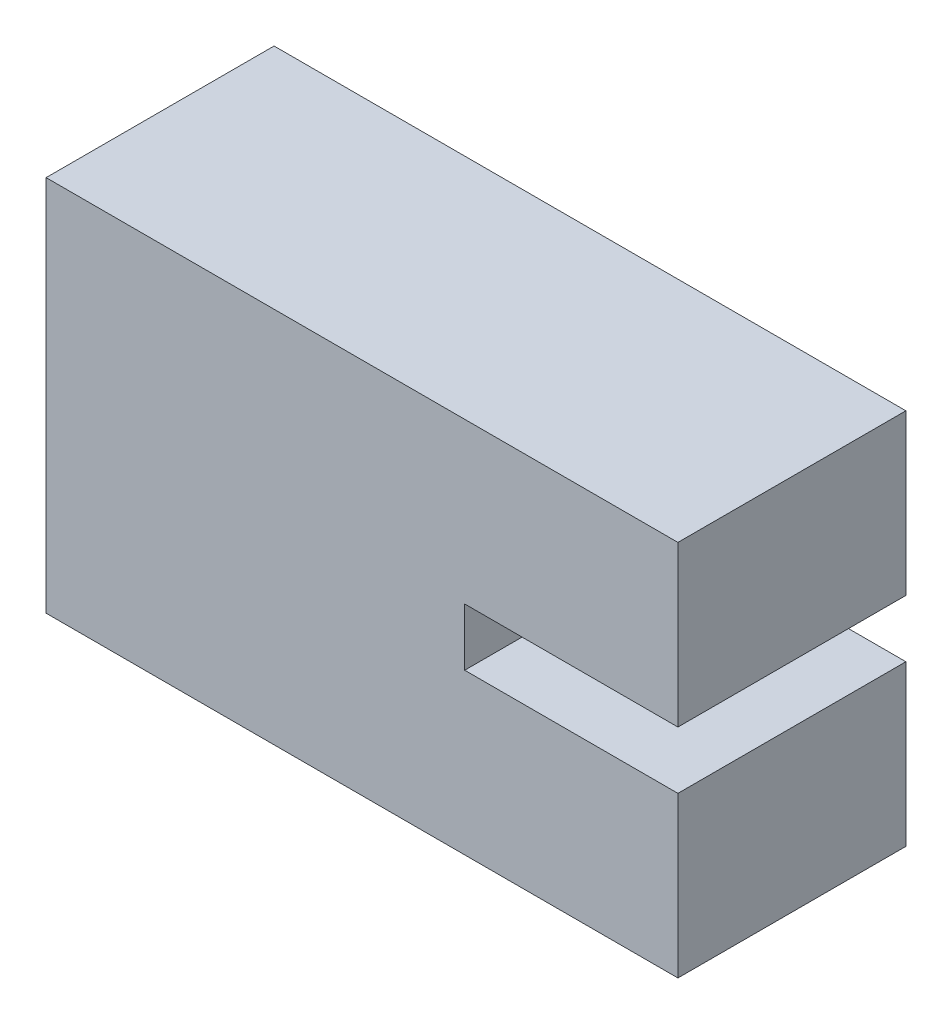
ISO-10303-21;
HEADER;
FILE_DESCRIPTION(('STEP AP214'),'2;1');
FILE_NAME('part.step','',(''),(''),'','','');
FILE_SCHEMA(('AUTOMOTIVE_DESIGN { 1 0 10303 214 1 1 1 1 }'));
ENDSEC;
DATA;
#1=APPLICATION_CONTEXT('core data for automotive mechanical design processes');
#2=APPLICATION_PROTOCOL_DEFINITION('international standard','automotive_design',2000,#1);
#3=PRODUCT_CONTEXT('',#1,'mechanical');
#4=PRODUCT('Part','Part','',(#3));
#5=PRODUCT_RELATED_PRODUCT_CATEGORY('part','',(#4));
#6=PRODUCT_DEFINITION_FORMATION('','',#4);
#7=PRODUCT_DEFINITION_CONTEXT('part definition',#1,'design');
#8=PRODUCT_DEFINITION('design','',#6,#7);
#9=PRODUCT_DEFINITION_SHAPE('','',#8);
#10=(LENGTH_UNIT() NAMED_UNIT(*) SI_UNIT(.MILLI.,.METRE.));
#11=(NAMED_UNIT(*) PLANE_ANGLE_UNIT() SI_UNIT($,.RADIAN.));
#12=(NAMED_UNIT(*) SI_UNIT($,.STERADIAN.) SOLID_ANGLE_UNIT());
#13=UNCERTAINTY_MEASURE_WITH_UNIT(LENGTH_MEASURE(1.E-05),#10,'distance_accuracy_value','');
#14=(GEOMETRIC_REPRESENTATION_CONTEXT(3) GLOBAL_UNCERTAINTY_ASSIGNED_CONTEXT((#13)) GLOBAL_UNIT_ASSIGNED_CONTEXT((#10,
#11,#12)) REPRESENTATION_CONTEXT('',''));
#15=CARTESIAN_POINT('',(0.,0.,0.));
#16=DIRECTION('',(0.,0.,1.));
#17=DIRECTION('',(1.,0.,0.));
#18=AXIS2_PLACEMENT_3D('',#15,#16,#17);
#19=CARTESIAN_POINT('',(19.7045905833706,0.,8.552959));
#20=DIRECTION('',(0.,1.,0.));
#21=DIRECTION('',(0.,0.,1.));
#22=AXIS2_PLACEMENT_3D('',#19,#20,#21);
#23=PLANE('',#22);
#24=DIRECTION('',(1.,0.,0.));
#25=VECTOR('',#24,1.);
#26=CARTESIAN_POINT('',(19.7045905833706,0.,0.));
#27=LINE('',#26,#25);
#28=CARTESIAN_POINT('',(-4.,0.,0.));
#29=VERTEX_POINT('',#28);
#30=CARTESIAN_POINT('',(19.7045905833706,0.,0.));
#31=VERTEX_POINT('',#30);
#32=EDGE_CURVE('E123',#29,#31,#27,.T.);
#33=ORIENTED_EDGE('',*,*,#32,.T.);
#34=DIRECTION('',(0.,0.,-1.));
#35=VECTOR('',#34,1.);
#36=CARTESIAN_POINT('',(19.7045905833706,0.,8.552959));
#37=LINE('',#36,#35);
#38=CARTESIAN_POINT('',(19.7045905833706,0.,8.552959));
#39=VERTEX_POINT('',#38);
#40=EDGE_CURVE('E11',#39,#31,#37,.T.);
#41=ORIENTED_EDGE('',*,*,#40,.F.);
#42=DIRECTION('',(1.,0.,0.));
#43=VECTOR('',#42,1.);
#44=CARTESIAN_POINT('',(19.7045905833706,0.,8.552959));
#45=LINE('',#44,#43);
#46=CARTESIAN_POINT('',(-4.,0.,8.552959));
#47=VERTEX_POINT('',#46);
#48=EDGE_CURVE('E137',#47,#39,#45,.T.);
#49=ORIENTED_EDGE('',*,*,#48,.F.);
#50=DIRECTION('',(0.,0.,1.));
#51=VECTOR('',#50,1.);
#52=CARTESIAN_POINT('',(-4.,0.,0.));
#53=LINE('',#52,#51);
#54=EDGE_CURVE('E165',#29,#47,#53,.T.);
#55=ORIENTED_EDGE('',*,*,#54,.F.);
#56=EDGE_LOOP('',(#33,#41,#49,#55));
#57=FACE_BOUND('',#56,.T.);
#58=ADVANCED_FACE('F33',(#57),#23,.F.);
#59=CARTESIAN_POINT('',(19.7045905833706,6.,8.552959));
#60=DIRECTION('',(-1.,0.,0.));
#61=DIRECTION('',(0.,-1.,0.));
#62=AXIS2_PLACEMENT_3D('',#59,#60,#61);
#63=PLANE('',#62);
#64=DIRECTION('',(0.,1.,0.));
#65=VECTOR('',#64,1.);
#66=CARTESIAN_POINT('',(19.7045905833706,6.,0.));
#67=LINE('',#66,#65);
#68=CARTESIAN_POINT('',(19.7045905833706,6.,0.));
#69=VERTEX_POINT('',#68);
#70=EDGE_CURVE('E126',#31,#69,#67,.T.);
#71=ORIENTED_EDGE('',*,*,#70,.T.);
#72=DIRECTION('',(0.,0.,-1.));
#73=VECTOR('',#72,1.);
#74=CARTESIAN_POINT('',(19.7045905833706,6.,8.552959));
#75=LINE('',#74,#73);
#76=CARTESIAN_POINT('',(19.7045905833706,6.,8.552959));
#77=VERTEX_POINT('',#76);
#78=EDGE_CURVE('E41',#77,#69,#75,.T.);
#79=ORIENTED_EDGE('',*,*,#78,.F.);
#80=DIRECTION('',(0.,1.,0.));
#81=VECTOR('',#80,1.);
#82=CARTESIAN_POINT('',(19.7045905833706,6.,8.552959));
#83=LINE('',#82,#81);
#84=EDGE_CURVE('E87',#39,#77,#83,.T.);
#85=ORIENTED_EDGE('',*,*,#84,.F.);
#86=ORIENTED_EDGE('',*,*,#40,.T.);
#87=EDGE_LOOP('',(#71,#79,#85,#86));
#88=FACE_BOUND('',#87,.T.);
#89=ADVANCED_FACE('F175',(#88),#63,.F.);
#90=CARTESIAN_POINT('',(11.7045905833706,6.,8.552959));
#91=DIRECTION('',(0.,-1.,0.));
#92=DIRECTION('',(1.,0.,0.));
#93=AXIS2_PLACEMENT_3D('',#90,#91,#92);
#94=PLANE('',#93);
#95=DIRECTION('',(-1.,0.,0.));
#96=VECTOR('',#95,1.);
#97=CARTESIAN_POINT('',(11.7045905833706,6.,0.));
#98=LINE('',#97,#96);
#99=CARTESIAN_POINT('',(11.7045905833706,6.,0.));
#100=VERTEX_POINT('',#99);
#101=EDGE_CURVE('E129',#69,#100,#98,.T.);
#102=ORIENTED_EDGE('',*,*,#101,.T.);
#103=DIRECTION('',(0.,0.,-1.));
#104=VECTOR('',#103,1.);
#105=CARTESIAN_POINT('',(11.7045905833706,6.,8.552959));
#106=LINE('',#105,#104);
#107=CARTESIAN_POINT('',(11.7045905833706,6.,8.552959));
#108=VERTEX_POINT('',#107);
#109=EDGE_CURVE('E112',#108,#100,#106,.T.);
#110=ORIENTED_EDGE('',*,*,#109,.F.);
#111=DIRECTION('',(-1.,0.,0.));
#112=VECTOR('',#111,1.);
#113=CARTESIAN_POINT('',(11.7045905833706,6.,8.552959));
#114=LINE('',#113,#112);
#115=EDGE_CURVE('E103',#77,#108,#114,.T.);
#116=ORIENTED_EDGE('',*,*,#115,.F.);
#117=ORIENTED_EDGE('',*,*,#78,.T.);
#118=EDGE_LOOP('',(#102,#110,#116,#117));
#119=FACE_BOUND('',#118,.T.);
#120=ADVANCED_FACE('F143',(#119),#94,.F.);
#121=CARTESIAN_POINT('',(11.7045905833706,8.1536931,8.552959));
#122=DIRECTION('',(-1.,0.,0.));
#123=DIRECTION('',(0.,0.,1.));
#124=AXIS2_PLACEMENT_3D('',#121,#122,#123);
#125=PLANE('',#124);
#126=DIRECTION('',(0.,1.,0.));
#127=VECTOR('',#126,1.);
#128=CARTESIAN_POINT('',(11.7045905833706,8.1536931,0.));
#129=LINE('',#128,#127);
#130=CARTESIAN_POINT('',(11.7045905833706,8.1536931,0.));
#131=VERTEX_POINT('',#130);
#132=EDGE_CURVE('E111',#100,#131,#129,.T.);
#133=ORIENTED_EDGE('',*,*,#132,.T.);
#134=DIRECTION('',(0.,0.,-1.));
#135=VECTOR('',#134,1.);
#136=CARTESIAN_POINT('',(11.7045905833706,8.1536931,8.552959));
#137=LINE('',#136,#135);
#138=CARTESIAN_POINT('',(11.7045905833706,8.1536931,8.552959));
#139=VERTEX_POINT('',#138);
#140=EDGE_CURVE('E108',#139,#131,#137,.T.);
#141=ORIENTED_EDGE('',*,*,#140,.F.);
#142=DIRECTION('',(0.,1.,0.));
#143=VECTOR('',#142,1.);
#144=CARTESIAN_POINT('',(11.7045905833706,8.1536931,8.552959));
#145=LINE('',#144,#143);
#146=EDGE_CURVE('E97',#108,#139,#145,.T.);
#147=ORIENTED_EDGE('',*,*,#146,.F.);
#148=ORIENTED_EDGE('',*,*,#109,.T.);
#149=EDGE_LOOP('',(#133,#141,#147,#148));
#150=FACE_BOUND('',#149,.T.);
#151=ADVANCED_FACE('F109',(#150),#125,.F.);
#152=CARTESIAN_POINT('',(19.7045905833706,8.1536931,8.552959));
#153=DIRECTION('',(0.,1.,0.));
#154=DIRECTION('',(-1.,0.,0.));
#155=AXIS2_PLACEMENT_3D('',#152,#153,#154);
#156=PLANE('',#155);
#157=DIRECTION('',(1.,0.,0.));
#158=VECTOR('',#157,1.);
#159=CARTESIAN_POINT('',(19.7045905833706,8.1536931,0.));
#160=LINE('',#159,#158);
#161=CARTESIAN_POINT('',(19.7045905833706,8.1536931,0.));
#162=VERTEX_POINT('',#161);
#163=EDGE_CURVE('E73',#131,#162,#160,.T.);
#164=ORIENTED_EDGE('',*,*,#163,.T.);
#165=DIRECTION('',(0.,0.,-1.));
#166=VECTOR('',#165,1.);
#167=CARTESIAN_POINT('',(19.7045905833706,8.1536931,8.552959));
#168=LINE('',#167,#166);
#169=CARTESIAN_POINT('',(19.7045905833706,8.1536931,8.552959));
#170=VERTEX_POINT('',#169);
#171=EDGE_CURVE('E113',#170,#162,#168,.T.);
#172=ORIENTED_EDGE('',*,*,#171,.F.);
#173=DIRECTION('',(1.,0.,0.));
#174=VECTOR('',#173,1.);
#175=CARTESIAN_POINT('',(19.7045905833706,8.1536931,8.552959));
#176=LINE('',#175,#174);
#177=EDGE_CURVE('E101',#139,#170,#176,.T.);
#178=ORIENTED_EDGE('',*,*,#177,.F.);
#179=ORIENTED_EDGE('',*,*,#140,.T.);
#180=EDGE_LOOP('',(#164,#172,#178,#179));
#181=FACE_BOUND('',#180,.T.);
#182=ADVANCED_FACE('F115',(#181),#156,.F.);
#183=CARTESIAN_POINT('',(19.7045905833705,14.1536931,8.552959));
#184=DIRECTION('',(-1.,0.,0.));
#185=DIRECTION('',(0.,-1.,0.));
#186=AXIS2_PLACEMENT_3D('',#183,#184,#185);
#187=PLANE('',#186);
#188=DIRECTION('',(0.,1.,0.));
#189=VECTOR('',#188,1.);
#190=CARTESIAN_POINT('',(19.7045905833705,14.1536931,0.));
#191=LINE('',#190,#189);
#192=CARTESIAN_POINT('',(19.7045905833705,14.1536931,0.));
#193=VERTEX_POINT('',#192);
#194=EDGE_CURVE('E79',#162,#193,#191,.T.);
#195=ORIENTED_EDGE('',*,*,#194,.T.);
#196=DIRECTION('',(0.,0.,-1.));
#197=VECTOR('',#196,1.);
#198=CARTESIAN_POINT('',(19.7045905833705,14.1536931,8.552959));
#199=LINE('',#198,#197);
#200=CARTESIAN_POINT('',(19.7045905833705,14.1536931,8.552959));
#201=VERTEX_POINT('',#200);
#202=EDGE_CURVE('E122',#201,#193,#199,.T.);
#203=ORIENTED_EDGE('',*,*,#202,.F.);
#204=DIRECTION('',(0.,1.,0.));
#205=VECTOR('',#204,1.);
#206=CARTESIAN_POINT('',(19.7045905833705,14.1536931,8.552959));
#207=LINE('',#206,#205);
#208=EDGE_CURVE('E49',#170,#201,#207,.T.);
#209=ORIENTED_EDGE('',*,*,#208,.F.);
#210=ORIENTED_EDGE('',*,*,#171,.T.);
#211=EDGE_LOOP('',(#195,#203,#209,#210));
#212=FACE_BOUND('',#211,.T.);
#213=ADVANCED_FACE('F187',(#212),#187,.F.);
#214=CARTESIAN_POINT('',(0.,14.1536931,8.552959));
#215=DIRECTION('',(0.,-1.,0.));
#216=DIRECTION('',(0.,0.,-1.));
#217=AXIS2_PLACEMENT_3D('',#214,#215,#216);
#218=PLANE('',#217);
#219=DIRECTION('',(-1.,0.,0.));
#220=VECTOR('',#219,1.);
#221=CARTESIAN_POINT('',(0.,14.1536931,0.));
#222=LINE('',#221,#220);
#223=CARTESIAN_POINT('',(-4.,14.1536931,0.));
#224=VERTEX_POINT('',#223);
#225=EDGE_CURVE('E134',#193,#224,#222,.T.);
#226=ORIENTED_EDGE('',*,*,#225,.T.);
#227=DIRECTION('',(0.,0.,-1.));
#228=VECTOR('',#227,1.);
#229=CARTESIAN_POINT('',(-4.,14.1536931,0.));
#230=LINE('',#229,#228);
#231=CARTESIAN_POINT('',(-4.,14.1536931,8.552959));
#232=VERTEX_POINT('',#231);
#233=EDGE_CURVE('E127',#232,#224,#230,.T.);
#234=ORIENTED_EDGE('',*,*,#233,.F.);
#235=DIRECTION('',(-1.,0.,0.));
#236=VECTOR('',#235,1.);
#237=CARTESIAN_POINT('',(0.,14.1536931,8.552959));
#238=LINE('',#237,#236);
#239=EDGE_CURVE('E117',#201,#232,#238,.T.);
#240=ORIENTED_EDGE('',*,*,#239,.F.);
#241=ORIENTED_EDGE('',*,*,#202,.T.);
#242=EDGE_LOOP('',(#226,#234,#240,#241));
#243=FACE_BOUND('',#242,.T.);
#244=ADVANCED_FACE('F154',(#243),#218,.F.);
#245=CARTESIAN_POINT('',(0.,0.,8.552959));
#246=DIRECTION('',(0.,0.,-1.));
#247=DIRECTION('',(-1.,0.,0.));
#248=AXIS2_PLACEMENT_3D('',#245,#246,#247);
#249=PLANE('',#248);
#250=ORIENTED_EDGE('',*,*,#48,.T.);
#251=ORIENTED_EDGE('',*,*,#84,.T.);
#252=ORIENTED_EDGE('',*,*,#115,.T.);
#253=ORIENTED_EDGE('',*,*,#146,.T.);
#254=ORIENTED_EDGE('',*,*,#177,.T.);
#255=ORIENTED_EDGE('',*,*,#208,.T.);
#256=ORIENTED_EDGE('',*,*,#239,.T.);
#257=DIRECTION('',(0.,1.,0.));
#258=VECTOR('',#257,1.);
#259=CARTESIAN_POINT('',(-4.,14.1536931,8.552959));
#260=LINE('',#259,#258);
#261=EDGE_CURVE('E163',#47,#232,#260,.T.);
#262=ORIENTED_EDGE('',*,*,#261,.F.);
#263=EDGE_LOOP('',(#250,#251,#252,#253,#254,#255,#256,#262));
#264=FACE_BOUND('',#263,.T.);
#265=ADVANCED_FACE('F99',(#264),#249,.F.);
#266=CARTESIAN_POINT('',(0.,0.,0.));
#267=DIRECTION('',(0.,0.,-1.));
#268=DIRECTION('',(-1.,0.,0.));
#269=AXIS2_PLACEMENT_3D('',#266,#267,#268);
#270=PLANE('',#269);
#271=ORIENTED_EDGE('',*,*,#32,.F.);
#272=DIRECTION('',(0.,-1.,0.));
#273=VECTOR('',#272,1.);
#274=CARTESIAN_POINT('',(-4.,14.1536931,0.));
#275=LINE('',#274,#273);
#276=EDGE_CURVE('E150',#224,#29,#275,.T.);
#277=ORIENTED_EDGE('',*,*,#276,.F.);
#278=ORIENTED_EDGE('',*,*,#225,.F.);
#279=ORIENTED_EDGE('',*,*,#194,.F.);
#280=ORIENTED_EDGE('',*,*,#163,.F.);
#281=ORIENTED_EDGE('',*,*,#132,.F.);
#282=ORIENTED_EDGE('',*,*,#101,.F.);
#283=ORIENTED_EDGE('',*,*,#70,.F.);
#284=EDGE_LOOP('',(#271,#277,#278,#279,#280,#281,#282,#283));
#285=FACE_BOUND('',#284,.T.);
#286=ADVANCED_FACE('F146',(#285),#270,.T.);
#287=CARTESIAN_POINT('',(-4.,0.,0.));
#288=DIRECTION('',(-1.,0.,0.));
#289=DIRECTION('',(0.,0.,1.));
#290=AXIS2_PLACEMENT_3D('',#287,#288,#289);
#291=PLANE('',#290);
#292=ORIENTED_EDGE('',*,*,#276,.T.);
#293=ORIENTED_EDGE('',*,*,#54,.T.);
#294=ORIENTED_EDGE('',*,*,#261,.T.);
#295=ORIENTED_EDGE('',*,*,#233,.T.);
#296=EDGE_LOOP('',(#292,#293,#294,#295));
#297=FACE_BOUND('',#296,.T.);
#298=ADVANCED_FACE('F159',(#297),#291,.T.);
#299=CLOSED_SHELL('',(#58,#89,#120,#151,#182,#213,#244,#265,#286,#298));
#300=MANIFOLD_SOLID_BREP('B2',#299);
#301=ADVANCED_BREP_SHAPE_REPRESENTATION('',(#18,#300),#14);
#302=SHAPE_DEFINITION_REPRESENTATION(#9,#301);
ENDSEC;
END-ISO-10303-21;
